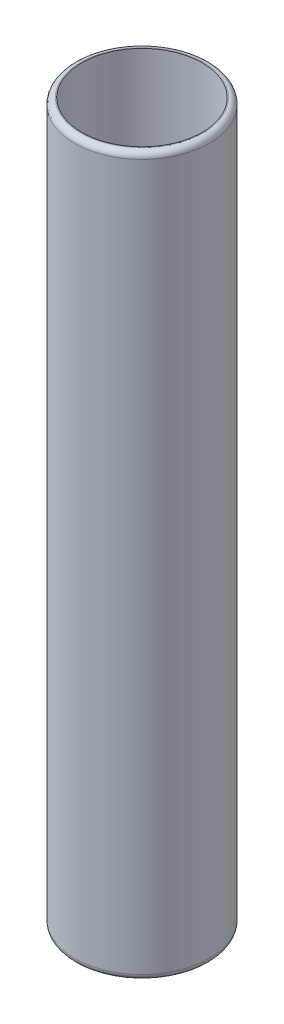
ISO-10303-21;
HEADER;
FILE_DESCRIPTION(('STEP AP214'),'2;1');
FILE_NAME('part.step','',(''),(''),'','','');
FILE_SCHEMA(('AUTOMOTIVE_DESIGN { 1 0 10303 214 1 1 1 1 }'));
ENDSEC;
DATA;
#1=APPLICATION_CONTEXT('core data for automotive mechanical design processes');
#2=APPLICATION_PROTOCOL_DEFINITION('international standard','automotive_design',2000,#1);
#3=PRODUCT_CONTEXT('',#1,'mechanical');
#4=PRODUCT('Part','Part','',(#3));
#5=PRODUCT_RELATED_PRODUCT_CATEGORY('part','',(#4));
#6=PRODUCT_DEFINITION_FORMATION('','',#4);
#7=PRODUCT_DEFINITION_CONTEXT('part definition',#1,'design');
#8=PRODUCT_DEFINITION('design','',#6,#7);
#9=PRODUCT_DEFINITION_SHAPE('','',#8);
#10=(LENGTH_UNIT() NAMED_UNIT(*) SI_UNIT(.MILLI.,.METRE.));
#11=(NAMED_UNIT(*) PLANE_ANGLE_UNIT() SI_UNIT($,.RADIAN.));
#12=(NAMED_UNIT(*) SI_UNIT($,.STERADIAN.) SOLID_ANGLE_UNIT());
#13=UNCERTAINTY_MEASURE_WITH_UNIT(LENGTH_MEASURE(1.E-05),#10,'distance_accuracy_value','');
#14=(GEOMETRIC_REPRESENTATION_CONTEXT(3) GLOBAL_UNCERTAINTY_ASSIGNED_CONTEXT((#13)) GLOBAL_UNIT_ASSIGNED_CONTEXT((#10,
#11,#12)) REPRESENTATION_CONTEXT('',''));
#15=CARTESIAN_POINT('',(0.,0.,0.));
#16=DIRECTION('',(0.,0.,1.));
#17=DIRECTION('',(1.,0.,0.));
#18=AXIS2_PLACEMENT_3D('',#15,#16,#17);
#19=CARTESIAN_POINT('',(0.,152.4,0.));
#20=DIRECTION('',(0.,1.,0.));
#21=DIRECTION('',(0.,0.,1.));
#22=AXIS2_PLACEMENT_3D('',#19,#20,#21);
#23=PLANE('',#22);
#24=CARTESIAN_POINT('',(0.,152.4,0.));
#25=DIRECTION('',(0.,1.,0.));
#26=DIRECTION('',(0.,0.,1.));
#27=AXIS2_PLACEMENT_3D('',#24,#25,#26);
#28=CIRCLE('',#27,13.0175);
#29=CARTESIAN_POINT('',(0.,152.4,13.0175));
#30=VERTEX_POINT('',#29);
#31=EDGE_CURVE('E59',#30,#30,#28,.T.);
#32=ORIENTED_EDGE('',*,*,#31,.T.);
#33=EDGE_LOOP('',(#32));
#34=FACE_BOUND('',#33,.T.);
#35=CARTESIAN_POINT('',(0.,152.4,0.));
#36=DIRECTION('',(0.,1.,0.));
#37=DIRECTION('',(0.,0.,1.));
#38=AXIS2_PLACEMENT_3D('',#35,#36,#37);
#39=CIRCLE('',#38,12.8143);
#40=CARTESIAN_POINT('',(0.,152.4,-12.8143));
#41=VERTEX_POINT('',#40);
#42=EDGE_CURVE('E65',#41,#41,#39,.T.);
#43=ORIENTED_EDGE('',*,*,#42,.F.);
#44=EDGE_LOOP('',(#43));
#45=FACE_BOUND('',#44,.T.);
#46=ADVANCED_FACE('F41',(#34,#45),#23,.T.);
#47=CARTESIAN_POINT('',(0.,0.,0.));
#48=DIRECTION('',(0.,1.,0.));
#49=DIRECTION('',(0.,0.,1.));
#50=AXIS2_PLACEMENT_3D('',#47,#48,#49);
#51=PLANE('',#50);
#52=CARTESIAN_POINT('',(0.,0.,0.));
#53=DIRECTION('',(0.,1.,0.));
#54=DIRECTION('',(0.,0.,1.));
#55=AXIS2_PLACEMENT_3D('',#52,#53,#54);
#56=CIRCLE('',#55,13.0175);
#57=CARTESIAN_POINT('',(0.,0.,13.0175));
#58=VERTEX_POINT('',#57);
#59=EDGE_CURVE('E10',#58,#58,#56,.F.);
#60=ORIENTED_EDGE('',*,*,#59,.T.);
#61=EDGE_LOOP('',(#60));
#62=FACE_BOUND('',#61,.T.);
#63=CARTESIAN_POINT('',(0.,0.,0.));
#64=DIRECTION('',(0.,1.,0.));
#65=DIRECTION('',(0.,0.,1.));
#66=AXIS2_PLACEMENT_3D('',#63,#64,#65);
#67=CIRCLE('',#66,12.8143);
#68=CARTESIAN_POINT('',(0.,0.,-12.8143));
#69=VERTEX_POINT('',#68);
#70=EDGE_CURVE('E66',#69,#69,#67,.T.);
#71=ORIENTED_EDGE('',*,*,#70,.T.);
#72=EDGE_LOOP('',(#71));
#73=FACE_BOUND('',#72,.T.);
#74=ADVANCED_FACE('F78',(#62,#73),#51,.F.);
#75=CARTESIAN_POINT('',(0.,152.4,0.));
#76=DIRECTION('',(0.,-1.,0.));
#77=DIRECTION('',(0.,0.,-1.));
#78=AXIS2_PLACEMENT_3D('',#75,#76,#77);
#79=CYLINDRICAL_SURFACE('',#78,14.2875);
#80=CARTESIAN_POINT('',(0.,151.13,0.));
#81=DIRECTION('',(0.,1.,0.));
#82=DIRECTION('',(0.,0.,1.));
#83=AXIS2_PLACEMENT_3D('',#80,#81,#82);
#84=CIRCLE('',#83,14.2875);
#85=CARTESIAN_POINT('',(0.,151.13,-14.2875));
#86=VERTEX_POINT('',#85);
#87=EDGE_CURVE('E49',#86,#86,#84,.F.);
#88=CARTESIAN_POINT('',(0.,1.26999999999999,0.));
#89=DIRECTION('',(0.,1.,0.));
#90=DIRECTION('',(0.,0.,1.));
#91=AXIS2_PLACEMENT_3D('',#88,#89,#90);
#92=CIRCLE('',#91,14.2875);
#93=CARTESIAN_POINT('',(0.,1.26999999999999,-14.2875));
#94=VERTEX_POINT('',#93);
#95=EDGE_CURVE('E54',#94,#94,#92,.T.);
#96=CARTESIAN_POINT('',(0.,151.13,-14.2875));
#97=CARTESIAN_POINT('',(0.,149.568958333333,-14.2875));
#98=CARTESIAN_POINT('',(0.,148.007916666667,-14.2875));
#99=CARTESIAN_POINT('',(0.,144.885833333333,-14.2875));
#100=CARTESIAN_POINT('',(0.,143.324791666667,-14.2875));
#101=CARTESIAN_POINT('',(0.,140.202708333333,-14.2875));
#102=CARTESIAN_POINT('',(0.,138.641666666667,-14.2875));
#103=CARTESIAN_POINT('',(0.,135.519583333333,-14.2875));
#104=CARTESIAN_POINT('',(0.,133.958541666667,-14.2875));
#105=CARTESIAN_POINT('',(0.,130.836458333333,-14.2875));
#106=CARTESIAN_POINT('',(0.,129.275416666667,-14.2875));
#107=CARTESIAN_POINT('',(0.,126.153333333333,-14.2875));
#108=CARTESIAN_POINT('',(0.,124.592291666667,-14.2875));
#109=CARTESIAN_POINT('',(0.,121.470208333333,-14.2875));
#110=CARTESIAN_POINT('',(0.,119.909166666667,-14.2875));
#111=CARTESIAN_POINT('',(0.,116.787083333333,-14.2875));
#112=CARTESIAN_POINT('',(0.,115.226041666667,-14.2875));
#113=CARTESIAN_POINT('',(0.,112.103958333333,-14.2875));
#114=CARTESIAN_POINT('',(0.,110.542916666667,-14.2875));
#115=CARTESIAN_POINT('',(0.,107.420833333333,-14.2875));
#116=CARTESIAN_POINT('',(0.,105.859791666667,-14.2875));
#117=CARTESIAN_POINT('',(0.,102.737708333333,-14.2875));
#118=CARTESIAN_POINT('',(0.,101.176666666667,-14.2875));
#119=CARTESIAN_POINT('',(0.,98.0545833333333,-14.2875));
#120=CARTESIAN_POINT('',(0.,96.4935416666667,-14.2875));
#121=CARTESIAN_POINT('',(0.,93.3714583333333,-14.2875));
#122=CARTESIAN_POINT('',(0.,91.8104166666667,-14.2875));
#123=CARTESIAN_POINT('',(0.,88.6883333333333,-14.2875));
#124=CARTESIAN_POINT('',(0.,87.1272916666667,-14.2875));
#125=CARTESIAN_POINT('',(0.,84.0052083333333,-14.2875));
#126=CARTESIAN_POINT('',(0.,82.4441666666666,-14.2875));
#127=CARTESIAN_POINT('',(0.,79.3220833333333,-14.2875));
#128=CARTESIAN_POINT('',(0.,77.7610416666667,-14.2875));
#129=CARTESIAN_POINT('',(0.,74.6389583333333,-14.2875));
#130=CARTESIAN_POINT('',(0.,73.0779166666667,-14.2875));
#131=CARTESIAN_POINT('',(0.,69.9558333333333,-14.2875));
#132=CARTESIAN_POINT('',(0.,68.3947916666666,-14.2875));
#133=CARTESIAN_POINT('',(0.,65.2727083333333,-14.2875));
#134=CARTESIAN_POINT('',(0.,63.7116666666667,-14.2875));
#135=CARTESIAN_POINT('',(0.,60.5895833333333,-14.2875));
#136=CARTESIAN_POINT('',(0.,59.0285416666666,-14.2875));
#137=CARTESIAN_POINT('',(0.,55.9064583333333,-14.2875));
#138=CARTESIAN_POINT('',(0.,54.3454166666666,-14.2875));
#139=CARTESIAN_POINT('',(0.,51.2233333333333,-14.2875));
#140=CARTESIAN_POINT('',(0.,49.6622916666666,-14.2875));
#141=CARTESIAN_POINT('',(0.,46.5402083333333,-14.2875));
#142=CARTESIAN_POINT('',(0.,44.9791666666666,-14.2875));
#143=CARTESIAN_POINT('',(0.,41.8570833333333,-14.2875));
#144=CARTESIAN_POINT('',(0.,40.2960416666666,-14.2875));
#145=CARTESIAN_POINT('',(0.,37.1739583333333,-14.2875));
#146=CARTESIAN_POINT('',(0.,35.6129166666666,-14.2875));
#147=CARTESIAN_POINT('',(0.,32.4908333333333,-14.2875));
#148=CARTESIAN_POINT('',(0.,30.9297916666666,-14.2875));
#149=CARTESIAN_POINT('',(0.,27.8077083333333,-14.2875));
#150=CARTESIAN_POINT('',(0.,26.2466666666667,-14.2875));
#151=CARTESIAN_POINT('',(0.,23.1245833333333,-14.2875));
#152=CARTESIAN_POINT('',(0.,21.5635416666666,-14.2875));
#153=CARTESIAN_POINT('',(0.,18.4414583333333,-14.2875));
#154=CARTESIAN_POINT('',(0.,16.8804166666666,-14.2875));
#155=CARTESIAN_POINT('',(0.,13.7583333333333,-14.2875));
#156=CARTESIAN_POINT('',(0.,12.1972916666666,-14.2875));
#157=CARTESIAN_POINT('',(0.,9.07520833333331,-14.2875));
#158=CARTESIAN_POINT('',(0.,7.51416666666666,-14.2875));
#159=CARTESIAN_POINT('',(0.,4.39208333333333,-14.2875));
#160=CARTESIAN_POINT('',(0.,2.83104166666666,-14.2875));
#161=CARTESIAN_POINT('',(0.,1.26999999999999,-14.2875));
#162=B_SPLINE_CURVE_WITH_KNOTS('',3,(#96,#97,#98,#99,#100,#101,#102,#103,#104,#105,#106,#107,
#108,#109,#110,#111,#112,#113,#114,#115,#116,#117,#118,#119,#120,#121,#122,#123,#124,#125,#126,
#127,#128,#129,#130,#131,#132,#133,#134,#135,#136,#137,#138,#139,#140,#141,#142,#143,#144,#145,
#146,#147,#148,#149,#150,#151,#152,#153,#154,#155,#156,#157,#158,#159,#160,#161),.UNSPECIFIED.,
.F.,.F.,(4,2,2,2,2,2,2,2,2,2,2,2,2,2,2,2,2,2,2,2,2,2,2,2,2,2,2,2,2,2,2,2,4),(0.,
4.68312500000001,9.36625000000002,14.049375,18.7325,23.415625,28.09875,32.781875,37.465,
42.148125,46.83125,51.514375,56.1975,60.880625,65.56375,70.246875,74.93,79.613125,84.29625,
88.979375,93.6625,98.345625,103.02875,107.711875,112.395,117.078125,121.76125,126.444375,
131.1275,135.810625,140.49375,145.176875,149.86),.UNSPECIFIED.);
#163=EDGE_CURVE('BSEAM84',#86,#94,#162,.T.);
#164=ORIENTED_EDGE('',*,*,#87,.T.);
#165=ORIENTED_EDGE('',*,*,#95,.T.);
#166=ORIENTED_EDGE('',*,*,#163,.T.);
#167=ORIENTED_EDGE('',*,*,#163,.F.);
#168=EDGE_LOOP('',(#164,#166,#165,#167));
#169=FACE_BOUND('',#168,.T.);
#170=ADVANCED_FACE('F84',(#169),#79,.T.);
#171=CARTESIAN_POINT('',(0.,152.4,0.));
#172=DIRECTION('',(0.,-1.,0.));
#173=DIRECTION('',(0.,0.,-1.));
#174=AXIS2_PLACEMENT_3D('',#171,#172,#173);
#175=CYLINDRICAL_SURFACE('',#174,12.8143);
#176=CARTESIAN_POINT('',(0.,152.4,-12.8143));
#177=CARTESIAN_POINT('',(0.,150.8125,-12.8143));
#178=CARTESIAN_POINT('',(0.,149.225,-12.8143));
#179=CARTESIAN_POINT('',(0.,146.05,-12.8143));
#180=CARTESIAN_POINT('',(0.,144.4625,-12.8143));
#181=CARTESIAN_POINT('',(0.,141.2875,-12.8143));
#182=CARTESIAN_POINT('',(0.,139.7,-12.8143));
#183=CARTESIAN_POINT('',(0.,136.525,-12.8143));
#184=CARTESIAN_POINT('',(0.,134.9375,-12.8143));
#185=CARTESIAN_POINT('',(0.,131.7625,-12.8143));
#186=CARTESIAN_POINT('',(0.,130.175,-12.8143));
#187=CARTESIAN_POINT('',(0.,127.,-12.8143));
#188=CARTESIAN_POINT('',(0.,125.4125,-12.8143));
#189=CARTESIAN_POINT('',(0.,122.2375,-12.8143));
#190=CARTESIAN_POINT('',(0.,120.65,-12.8143));
#191=CARTESIAN_POINT('',(0.,117.475,-12.8143));
#192=CARTESIAN_POINT('',(0.,115.8875,-12.8143));
#193=CARTESIAN_POINT('',(0.,112.7125,-12.8143));
#194=CARTESIAN_POINT('',(0.,111.125,-12.8143));
#195=CARTESIAN_POINT('',(0.,107.95,-12.8143));
#196=CARTESIAN_POINT('',(0.,106.3625,-12.8143));
#197=CARTESIAN_POINT('',(0.,103.1875,-12.8143));
#198=CARTESIAN_POINT('',(0.,101.6,-12.8143));
#199=CARTESIAN_POINT('',(0.,98.425,-12.8143));
#200=CARTESIAN_POINT('',(0.,96.8375,-12.8143));
#201=CARTESIAN_POINT('',(0.,93.6625,-12.8143));
#202=CARTESIAN_POINT('',(0.,92.075,-12.8143));
#203=CARTESIAN_POINT('',(0.,88.9,-12.8143));
#204=CARTESIAN_POINT('',(0.,87.3125,-12.8143));
#205=CARTESIAN_POINT('',(0.,84.1375,-12.8143));
#206=CARTESIAN_POINT('',(0.,82.55,-12.8143));
#207=CARTESIAN_POINT('',(0.,79.375,-12.8143));
#208=CARTESIAN_POINT('',(0.,77.7875,-12.8143));
#209=CARTESIAN_POINT('',(0.,74.6125,-12.8143));
#210=CARTESIAN_POINT('',(0.,73.025,-12.8143));
#211=CARTESIAN_POINT('',(0.,69.85,-12.8143));
#212=CARTESIAN_POINT('',(0.,68.2625,-12.8143));
#213=CARTESIAN_POINT('',(0.,65.0875,-12.8143));
#214=CARTESIAN_POINT('',(0.,63.5,-12.8143));
#215=CARTESIAN_POINT('',(0.,60.325,-12.8143));
#216=CARTESIAN_POINT('',(0.,58.7375,-12.8143));
#217=CARTESIAN_POINT('',(0.,55.5625,-12.8143));
#218=CARTESIAN_POINT('',(0.,53.975,-12.8143));
#219=CARTESIAN_POINT('',(0.,50.8,-12.8143));
#220=CARTESIAN_POINT('',(0.,49.2125,-12.8143));
#221=CARTESIAN_POINT('',(0.,46.0375,-12.8143));
#222=CARTESIAN_POINT('',(0.,44.45,-12.8143));
#223=CARTESIAN_POINT('',(0.,41.275,-12.8143));
#224=CARTESIAN_POINT('',(0.,39.6875,-12.8143));
#225=CARTESIAN_POINT('',(0.,36.5125,-12.8143));
#226=CARTESIAN_POINT('',(0.,34.925,-12.8143));
#227=CARTESIAN_POINT('',(0.,31.75,-12.8143));
#228=CARTESIAN_POINT('',(0.,30.1625,-12.8143));
#229=CARTESIAN_POINT('',(0.,26.9875,-12.8143));
#230=CARTESIAN_POINT('',(0.,25.4,-12.8143));
#231=CARTESIAN_POINT('',(0.,22.225,-12.8143));
#232=CARTESIAN_POINT('',(0.,20.6375,-12.8143));
#233=CARTESIAN_POINT('',(0.,17.4625,-12.8143));
#234=CARTESIAN_POINT('',(0.,15.875,-12.8143));
#235=CARTESIAN_POINT('',(0.,12.7,-12.8143));
#236=CARTESIAN_POINT('',(0.,11.1125,-12.8143));
#237=CARTESIAN_POINT('',(0.,7.93750000000001,-12.8143));
#238=CARTESIAN_POINT('',(0.,6.35,-12.8143));
#239=CARTESIAN_POINT('',(0.,3.175,-12.8143));
#240=CARTESIAN_POINT('',(0.,1.5875,-12.8143));
#241=CARTESIAN_POINT('',(0.,0.,-12.8143));
#242=B_SPLINE_CURVE_WITH_KNOTS('',3,(#176,#177,#178,#179,#180,#181,#182,#183,#184,#185,#186,
#187,#188,#189,#190,#191,#192,#193,#194,#195,#196,#197,#198,#199,#200,#201,#202,#203,#204,#205,
#206,#207,#208,#209,#210,#211,#212,#213,#214,#215,#216,#217,#218,#219,#220,#221,#222,#223,#224,
#225,#226,#227,#228,#229,#230,#231,#232,#233,#234,#235,#236,#237,#238,#239,#240,#241),
.UNSPECIFIED.,.F.,.F.,(4,2,2,2,2,2,2,2,2,2,2,2,2,2,2,2,2,2,2,2,2,2,2,2,2,2,2,2,2,2,2,2,4),(0.,
4.7625,9.52500000000001,14.2875,19.05,23.8125,28.575,33.3375,38.1,42.8625,47.625,52.3875,57.15,
61.9125,66.675,71.4375,76.2,80.9625,85.725,90.4875,95.25,100.0125,104.775,109.5375,114.3,
119.0625,123.825,128.5875,133.35,138.1125,142.875,147.6375,152.4),.UNSPECIFIED.);
#243=EDGE_CURVE('BSEAM74',#41,#69,#242,.T.);
#244=ORIENTED_EDGE('',*,*,#42,.T.);
#245=ORIENTED_EDGE('',*,*,#70,.F.);
#246=ORIENTED_EDGE('',*,*,#243,.T.);
#247=ORIENTED_EDGE('',*,*,#243,.F.);
#248=EDGE_LOOP('',(#244,#246,#245,#247));
#249=FACE_BOUND('',#248,.T.);
#250=ADVANCED_FACE('F74',(#249),#175,.F.);
#251=CARTESIAN_POINT('',(0.,151.13,0.));
#252=DIRECTION('',(0.,1.,0.));
#253=DIRECTION('',(0.,0.,1.));
#254=AXIS2_PLACEMENT_3D('',#251,#252,#253);
#255=TOROIDAL_SURFACE('',#254,13.0175,1.27);
#256=ORIENTED_EDGE('',*,*,#87,.F.);
#257=EDGE_LOOP('',(#256));
#258=FACE_BOUND('',#257,.T.);
#259=ORIENTED_EDGE('',*,*,#31,.F.);
#260=EDGE_LOOP('',(#259));
#261=FACE_BOUND('',#260,.T.);
#262=ADVANCED_FACE('F89',(#258,#261),#255,.T.);
#263=CARTESIAN_POINT('',(0.,1.26999999999999,0.));
#264=DIRECTION('',(0.,1.,0.));
#265=DIRECTION('',(0.,0.,1.));
#266=AXIS2_PLACEMENT_3D('',#263,#264,#265);
#267=TOROIDAL_SURFACE('',#266,13.0175,1.27);
#268=ORIENTED_EDGE('',*,*,#59,.F.);
#269=EDGE_LOOP('',(#268));
#270=FACE_BOUND('',#269,.T.);
#271=ORIENTED_EDGE('',*,*,#95,.F.);
#272=EDGE_LOOP('',(#271));
#273=FACE_BOUND('',#272,.T.);
#274=ADVANCED_FACE('F43',(#270,#273),#267,.T.);
#275=CLOSED_SHELL('',(#46,#74,#170,#250,#262,#274));
#276=MANIFOLD_SOLID_BREP('B2',#275);
#277=ADVANCED_BREP_SHAPE_REPRESENTATION('',(#18,#276),#14);
#278=SHAPE_DEFINITION_REPRESENTATION(#9,#277);
ENDSEC;
END-ISO-10303-21;
